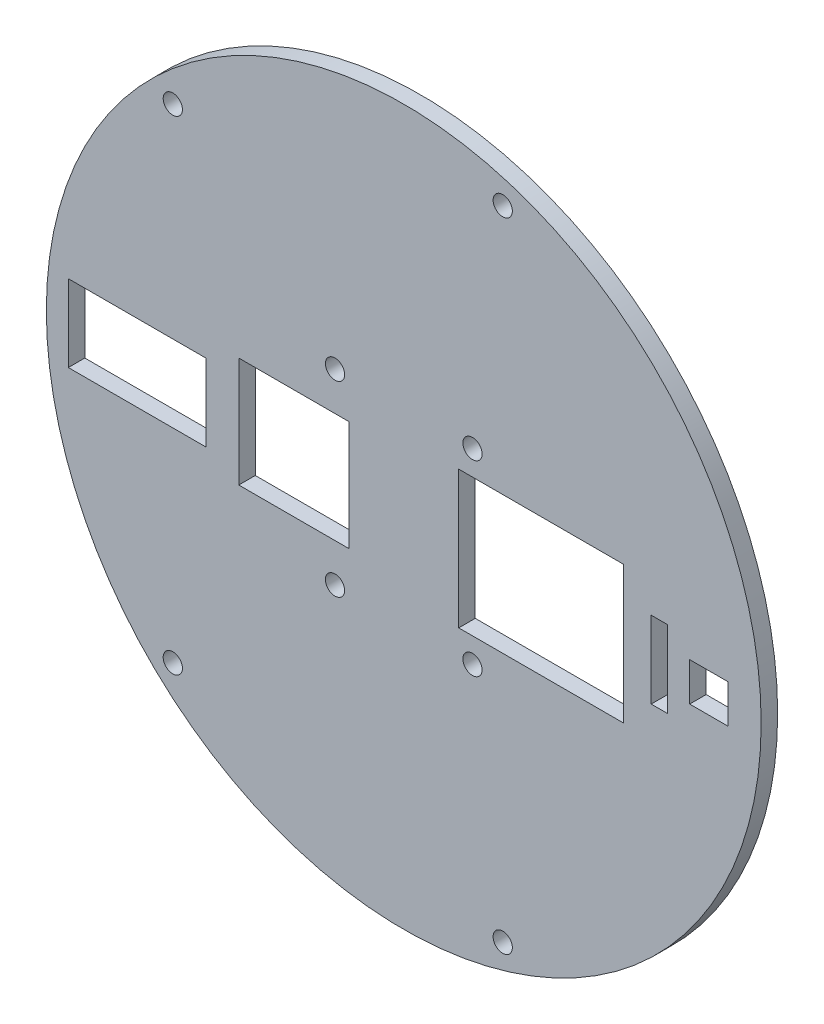
ISO-10303-21;
HEADER;
FILE_DESCRIPTION(('STEP AP214'),'2;1');
FILE_NAME('part.step','',(''),(''),'','','');
FILE_SCHEMA(('AUTOMOTIVE_DESIGN { 1 0 10303 214 1 1 1 1 }'));
ENDSEC;
DATA;
#1=APPLICATION_CONTEXT('core data for automotive mechanical design processes');
#2=APPLICATION_PROTOCOL_DEFINITION('international standard','automotive_design',2000,#1);
#3=PRODUCT_CONTEXT('',#1,'mechanical');
#4=PRODUCT('Part','Part','',(#3));
#5=PRODUCT_RELATED_PRODUCT_CATEGORY('part','',(#4));
#6=PRODUCT_DEFINITION_FORMATION('','',#4);
#7=PRODUCT_DEFINITION_CONTEXT('part definition',#1,'design');
#8=PRODUCT_DEFINITION('design','',#6,#7);
#9=PRODUCT_DEFINITION_SHAPE('','',#8);
#10=(LENGTH_UNIT() NAMED_UNIT(*) SI_UNIT(.MILLI.,.METRE.));
#11=(NAMED_UNIT(*) PLANE_ANGLE_UNIT() SI_UNIT($,.RADIAN.));
#12=(NAMED_UNIT(*) SI_UNIT($,.STERADIAN.) SOLID_ANGLE_UNIT());
#13=UNCERTAINTY_MEASURE_WITH_UNIT(LENGTH_MEASURE(1.E-05),#10,'distance_accuracy_value','');
#14=(GEOMETRIC_REPRESENTATION_CONTEXT(3) GLOBAL_UNCERTAINTY_ASSIGNED_CONTEXT((#13)) GLOBAL_UNIT_ASSIGNED_CONTEXT((#10,
#11,#12)) REPRESENTATION_CONTEXT('',''));
#15=CARTESIAN_POINT('',(0.,0.,0.));
#16=DIRECTION('',(0.,0.,1.));
#17=DIRECTION('',(1.,0.,0.));
#18=AXIS2_PLACEMENT_3D('',#15,#16,#17);
#19=CARTESIAN_POINT('',(0.,0.,3.));
#20=DIRECTION('',(0.,0.,1.));
#21=DIRECTION('',(1.,0.,0.));
#22=AXIS2_PLACEMENT_3D('',#19,#20,#21);
#23=PLANE('',#22);
#24=CARTESIAN_POINT('',(-42.,-44.,3.));
#25=DIRECTION('',(0.,0.,1.));
#26=DIRECTION('',(-1.,0.,0.));
#27=AXIS2_PLACEMENT_3D('',#24,#25,#26);
#28=CIRCLE('',#27,1.75);
#29=CARTESIAN_POINT('',(-43.75,-44.,3.));
#30=VERTEX_POINT('',#29);
#31=EDGE_CURVE('E536',#30,#30,#28,.T.);
#32=ORIENTED_EDGE('',*,*,#31,.F.);
#33=EDGE_LOOP('',(#32));
#34=FACE_BOUND('',#33,.T.);
#35=CARTESIAN_POINT('',(18.,-58.,3.));
#36=DIRECTION('',(0.,0.,1.));
#37=DIRECTION('',(-1.,0.,0.));
#38=AXIS2_PLACEMENT_3D('',#35,#36,#37);
#39=CIRCLE('',#38,1.75);
#40=CARTESIAN_POINT('',(16.25,-58.,3.));
#41=VERTEX_POINT('',#40);
#42=EDGE_CURVE('E538',#41,#41,#39,.T.);
#43=ORIENTED_EDGE('',*,*,#42,.F.);
#44=EDGE_LOOP('',(#43));
#45=FACE_BOUND('',#44,.T.);
#46=CARTESIAN_POINT('',(18.,58.,3.));
#47=DIRECTION('',(0.,0.,1.));
#48=DIRECTION('',(1.,0.,0.));
#49=AXIS2_PLACEMENT_3D('',#46,#47,#48);
#50=CIRCLE('',#49,1.75);
#51=CARTESIAN_POINT('',(19.75,58.,3.));
#52=VERTEX_POINT('',#51);
#53=EDGE_CURVE('E549',#52,#52,#50,.T.);
#54=ORIENTED_EDGE('',*,*,#53,.F.);
#55=EDGE_LOOP('',(#54));
#56=FACE_BOUND('',#55,.T.);
#57=CARTESIAN_POINT('',(-42.,44.,3.));
#58=DIRECTION('',(0.,0.,1.));
#59=DIRECTION('',(1.,0.,0.));
#60=AXIS2_PLACEMENT_3D('',#57,#58,#59);
#61=CIRCLE('',#60,1.75);
#62=CARTESIAN_POINT('',(-40.25,44.,3.));
#63=VERTEX_POINT('',#62);
#64=EDGE_CURVE('E543',#63,#63,#61,.T.);
#65=ORIENTED_EDGE('',*,*,#64,.F.);
#66=EDGE_LOOP('',(#65));
#67=FACE_BOUND('',#66,.T.);
#68=CARTESIAN_POINT('',(12.5,-17.,3.));
#69=DIRECTION('',(0.,0.,1.));
#70=DIRECTION('',(-1.,0.,0.));
#71=AXIS2_PLACEMENT_3D('',#68,#69,#70);
#72=CIRCLE('',#71,1.75);
#73=CARTESIAN_POINT('',(10.75,-17.,3.));
#74=VERTEX_POINT('',#73);
#75=EDGE_CURVE('E219',#74,#74,#72,.T.);
#76=ORIENTED_EDGE('',*,*,#75,.F.);
#77=EDGE_LOOP('',(#76));
#78=FACE_BOUND('',#77,.T.);
#79=CARTESIAN_POINT('',(-12.5,17.,3.));
#80=DIRECTION('',(0.,0.,1.));
#81=DIRECTION('',(1.,0.,0.));
#82=AXIS2_PLACEMENT_3D('',#79,#80,#81);
#83=CIRCLE('',#82,1.75);
#84=CARTESIAN_POINT('',(-10.75,17.,3.));
#85=VERTEX_POINT('',#84);
#86=EDGE_CURVE('E262',#85,#85,#83,.T.);
#87=ORIENTED_EDGE('',*,*,#86,.F.);
#88=EDGE_LOOP('',(#87));
#89=FACE_BOUND('',#88,.T.);
#90=CARTESIAN_POINT('',(0.,0.,3.));
#91=DIRECTION('',(0.,0.,1.));
#92=DIRECTION('',(1.,0.,0.));
#93=AXIS2_PLACEMENT_3D('',#90,#91,#92);
#94=CIRCLE('',#93,65.);
#95=CARTESIAN_POINT('',(65.,0.,3.));
#96=VERTEX_POINT('',#95);
#97=EDGE_CURVE('E11',#96,#96,#94,.T.);
#98=ORIENTED_EDGE('',*,*,#97,.T.);
#99=EDGE_LOOP('',(#98));
#100=FACE_BOUND('',#99,.T.);
#101=DIRECTION('',(1.,0.,0.));
#102=VECTOR('',#101,1.);
#103=CARTESIAN_POINT('',(-30.,-10.,3.));
#104=LINE('',#103,#102);
#105=CARTESIAN_POINT('',(-30.,-10.,3.));
#106=VERTEX_POINT('',#105);
#107=CARTESIAN_POINT('',(-9.99999999999999,-10.,3.));
#108=VERTEX_POINT('',#107);
#109=EDGE_CURVE('E332',#106,#108,#104,.T.);
#110=ORIENTED_EDGE('',*,*,#109,.F.);
#111=DIRECTION('',(0.,-1.,0.));
#112=VECTOR('',#111,1.);
#113=CARTESIAN_POINT('',(-30.,10.,3.));
#114=LINE('',#113,#112);
#115=CARTESIAN_POINT('',(-30.,10.,3.));
#116=VERTEX_POINT('',#115);
#117=EDGE_CURVE('E330',#116,#106,#114,.T.);
#118=ORIENTED_EDGE('',*,*,#117,.F.);
#119=DIRECTION('',(-1.,0.,0.));
#120=VECTOR('',#119,1.);
#121=CARTESIAN_POINT('',(-30.,10.,3.));
#122=LINE('',#121,#120);
#123=CARTESIAN_POINT('',(-9.99999999999999,10.,3.));
#124=VERTEX_POINT('',#123);
#125=EDGE_CURVE('E338',#124,#116,#122,.T.);
#126=ORIENTED_EDGE('',*,*,#125,.F.);
#127=DIRECTION('',(0.,1.,0.));
#128=VECTOR('',#127,1.);
#129=CARTESIAN_POINT('',(-9.99999999999999,10.,3.));
#130=LINE('',#129,#128);
#131=EDGE_CURVE('E335',#108,#124,#130,.T.);
#132=ORIENTED_EDGE('',*,*,#131,.F.);
#133=EDGE_LOOP('',(#110,#118,#126,#132));
#134=FACE_BOUND('',#133,.T.);
#135=DIRECTION('',(1.,0.,0.));
#136=VECTOR('',#135,1.);
#137=CARTESIAN_POINT('',(-61.,-6.99999999999991,3.));
#138=LINE('',#137,#136);
#139=CARTESIAN_POINT('',(-61.,-6.99999999999991,3.));
#140=VERTEX_POINT('',#139);
#141=CARTESIAN_POINT('',(-36.,-6.99999999999991,3.));
#142=VERTEX_POINT('',#141);
#143=EDGE_CURVE('E301',#140,#142,#138,.T.);
#144=ORIENTED_EDGE('',*,*,#143,.F.);
#145=DIRECTION('',(0.,-1.,0.));
#146=VECTOR('',#145,1.);
#147=CARTESIAN_POINT('',(-61.,7.,3.));
#148=LINE('',#147,#146);
#149=CARTESIAN_POINT('',(-61.,7.,3.));
#150=VERTEX_POINT('',#149);
#151=EDGE_CURVE('E299',#150,#140,#148,.T.);
#152=ORIENTED_EDGE('',*,*,#151,.F.);
#153=DIRECTION('',(-1.,0.,0.));
#154=VECTOR('',#153,1.);
#155=CARTESIAN_POINT('',(-61.,7.,3.));
#156=LINE('',#155,#154);
#157=CARTESIAN_POINT('',(-36.,7.,3.));
#158=VERTEX_POINT('',#157);
#159=EDGE_CURVE('E307',#158,#150,#156,.T.);
#160=ORIENTED_EDGE('',*,*,#159,.F.);
#161=DIRECTION('',(0.,1.,0.));
#162=VECTOR('',#161,1.);
#163=CARTESIAN_POINT('',(-36.,7.,3.));
#164=LINE('',#163,#162);
#165=EDGE_CURVE('E304',#142,#158,#164,.T.);
#166=ORIENTED_EDGE('',*,*,#165,.F.);
#167=EDGE_LOOP('',(#144,#152,#160,#166));
#168=FACE_BOUND('',#167,.T.);
#169=DIRECTION('',(1.,0.,0.));
#170=VECTOR('',#169,1.);
#171=CARTESIAN_POINT('',(10.,-12.5,3.));
#172=LINE('',#171,#170);
#173=CARTESIAN_POINT('',(10.,-12.5,3.));
#174=VERTEX_POINT('',#173);
#175=CARTESIAN_POINT('',(40.,-12.5,3.));
#176=VERTEX_POINT('',#175);
#177=EDGE_CURVE('E270',#174,#176,#172,.T.);
#178=ORIENTED_EDGE('',*,*,#177,.F.);
#179=DIRECTION('',(0.,-1.,0.));
#180=VECTOR('',#179,1.);
#181=CARTESIAN_POINT('',(10.,12.5,3.));
#182=LINE('',#181,#180);
#183=CARTESIAN_POINT('',(10.,12.5,3.));
#184=VERTEX_POINT('',#183);
#185=EDGE_CURVE('E268',#184,#174,#182,.T.);
#186=ORIENTED_EDGE('',*,*,#185,.F.);
#187=DIRECTION('',(-1.,0.,0.));
#188=VECTOR('',#187,1.);
#189=CARTESIAN_POINT('',(10.,12.5,3.));
#190=LINE('',#189,#188);
#191=CARTESIAN_POINT('',(40.,12.5,3.));
#192=VERTEX_POINT('',#191);
#193=EDGE_CURVE('E276',#192,#184,#190,.T.);
#194=ORIENTED_EDGE('',*,*,#193,.F.);
#195=DIRECTION('',(0.,1.,0.));
#196=VECTOR('',#195,1.);
#197=CARTESIAN_POINT('',(40.,12.5,3.));
#198=LINE('',#197,#196);
#199=EDGE_CURVE('E273',#176,#192,#198,.T.);
#200=ORIENTED_EDGE('',*,*,#199,.F.);
#201=EDGE_LOOP('',(#178,#186,#194,#200));
#202=FACE_BOUND('',#201,.T.);
#203=CARTESIAN_POINT('',(12.5,17.,3.));
#204=DIRECTION('',(0.,0.,1.));
#205=DIRECTION('',(1.,0.,0.));
#206=AXIS2_PLACEMENT_3D('',#203,#204,#205);
#207=CIRCLE('',#206,1.75);
#208=CARTESIAN_POINT('',(14.25,17.,3.));
#209=VERTEX_POINT('',#208);
#210=EDGE_CURVE('E256',#209,#209,#207,.T.);
#211=ORIENTED_EDGE('',*,*,#210,.F.);
#212=EDGE_LOOP('',(#211));
#213=FACE_BOUND('',#212,.T.);
#214=DIRECTION('',(1.,0.,0.));
#215=VECTOR('',#214,1.);
#216=CARTESIAN_POINT('',(52.,-3.5,3.));
#217=LINE('',#216,#215);
#218=CARTESIAN_POINT('',(52.,-3.5,3.));
#219=VERTEX_POINT('',#218);
#220=CARTESIAN_POINT('',(59.,-3.5,3.));
#221=VERTEX_POINT('',#220);
#222=EDGE_CURVE('E227',#219,#221,#217,.T.);
#223=ORIENTED_EDGE('',*,*,#222,.F.);
#224=DIRECTION('',(0.,-1.,0.));
#225=VECTOR('',#224,1.);
#226=CARTESIAN_POINT('',(52.,3.5,3.));
#227=LINE('',#226,#225);
#228=CARTESIAN_POINT('',(52.,3.5,3.));
#229=VERTEX_POINT('',#228);
#230=EDGE_CURVE('E225',#229,#219,#227,.T.);
#231=ORIENTED_EDGE('',*,*,#230,.F.);
#232=DIRECTION('',(-1.,0.,0.));
#233=VECTOR('',#232,1.);
#234=CARTESIAN_POINT('',(52.,3.5,3.));
#235=LINE('',#234,#233);
#236=CARTESIAN_POINT('',(59.,3.5,3.));
#237=VERTEX_POINT('',#236);
#238=EDGE_CURVE('E233',#237,#229,#235,.T.);
#239=ORIENTED_EDGE('',*,*,#238,.F.);
#240=DIRECTION('',(0.,1.,0.));
#241=VECTOR('',#240,1.);
#242=CARTESIAN_POINT('',(59.,3.5,3.));
#243=LINE('',#242,#241);
#244=EDGE_CURVE('E230',#221,#237,#243,.T.);
#245=ORIENTED_EDGE('',*,*,#244,.F.);
#246=EDGE_LOOP('',(#223,#231,#239,#245));
#247=FACE_BOUND('',#246,.T.);
#248=CARTESIAN_POINT('',(-12.5,-17.,3.));
#249=DIRECTION('',(0.,0.,1.));
#250=DIRECTION('',(-1.,0.,0.));
#251=AXIS2_PLACEMENT_3D('',#248,#249,#250);
#252=CIRCLE('',#251,1.75);
#253=CARTESIAN_POINT('',(-14.25,-17.,3.));
#254=VERTEX_POINT('',#253);
#255=EDGE_CURVE('E213',#254,#254,#252,.T.);
#256=ORIENTED_EDGE('',*,*,#255,.F.);
#257=EDGE_LOOP('',(#256));
#258=FACE_BOUND('',#257,.T.);
#259=DIRECTION('',(1.,0.,0.));
#260=VECTOR('',#259,1.);
#261=CARTESIAN_POINT('',(45.,-6.99999999999991,3.));
#262=LINE('',#261,#260);
#263=CARTESIAN_POINT('',(45.,-6.99999999999991,3.));
#264=VERTEX_POINT('',#263);
#265=CARTESIAN_POINT('',(48.,-6.99999999999991,3.));
#266=VERTEX_POINT('',#265);
#267=EDGE_CURVE('E183',#264,#266,#262,.T.);
#268=ORIENTED_EDGE('',*,*,#267,.F.);
#269=DIRECTION('',(0.,-1.,0.));
#270=VECTOR('',#269,1.);
#271=CARTESIAN_POINT('',(45.,7.,3.));
#272=LINE('',#271,#270);
#273=CARTESIAN_POINT('',(45.,7.,3.));
#274=VERTEX_POINT('',#273);
#275=EDGE_CURVE('E175',#274,#264,#272,.T.);
#276=ORIENTED_EDGE('',*,*,#275,.F.);
#277=DIRECTION('',(-1.,0.,0.));
#278=VECTOR('',#277,1.);
#279=CARTESIAN_POINT('',(45.,7.,3.));
#280=LINE('',#279,#278);
#281=CARTESIAN_POINT('',(48.,7.,3.));
#282=VERTEX_POINT('',#281);
#283=EDGE_CURVE('E197',#282,#274,#280,.T.);
#284=ORIENTED_EDGE('',*,*,#283,.F.);
#285=DIRECTION('',(0.,1.,0.));
#286=VECTOR('',#285,1.);
#287=CARTESIAN_POINT('',(48.,7.,3.));
#288=LINE('',#287,#286);
#289=EDGE_CURVE('E195',#266,#282,#288,.T.);
#290=ORIENTED_EDGE('',*,*,#289,.F.);
#291=EDGE_LOOP('',(#268,#276,#284,#290));
#292=FACE_BOUND('',#291,.T.);
#293=ADVANCED_FACE('F38',(#34,#45,#56,#67,#78,#89,#100,#134,#168,#202,#213,#247,#258,#292),#23,.T.);
#294=CARTESIAN_POINT('',(0.,0.,0.));
#295=DIRECTION('',(0.,0.,1.));
#296=DIRECTION('',(1.,0.,0.));
#297=AXIS2_PLACEMENT_3D('',#294,#295,#296);
#298=PLANE('',#297);
#299=CARTESIAN_POINT('',(-42.,-44.,0.));
#300=DIRECTION('',(0.,0.,1.));
#301=DIRECTION('',(-1.,0.,0.));
#302=AXIS2_PLACEMENT_3D('',#299,#300,#301);
#303=CIRCLE('',#302,1.75);
#304=CARTESIAN_POINT('',(-43.75,-44.,0.));
#305=VERTEX_POINT('',#304);
#306=EDGE_CURVE('E534',#305,#305,#303,.T.);
#307=ORIENTED_EDGE('',*,*,#306,.T.);
#308=EDGE_LOOP('',(#307));
#309=FACE_BOUND('',#308,.T.);
#310=CARTESIAN_POINT('',(18.,-58.,0.));
#311=DIRECTION('',(0.,0.,1.));
#312=DIRECTION('',(-1.,0.,0.));
#313=AXIS2_PLACEMENT_3D('',#310,#311,#312);
#314=CIRCLE('',#313,1.75);
#315=CARTESIAN_POINT('',(16.25,-58.,0.));
#316=VERTEX_POINT('',#315);
#317=EDGE_CURVE('E554',#316,#316,#314,.T.);
#318=ORIENTED_EDGE('',*,*,#317,.T.);
#319=EDGE_LOOP('',(#318));
#320=FACE_BOUND('',#319,.T.);
#321=CARTESIAN_POINT('',(18.,58.,0.));
#322=DIRECTION('',(0.,0.,1.));
#323=DIRECTION('',(1.,0.,0.));
#324=AXIS2_PLACEMENT_3D('',#321,#322,#323);
#325=CIRCLE('',#324,1.75);
#326=CARTESIAN_POINT('',(19.75,58.,0.));
#327=VERTEX_POINT('',#326);
#328=EDGE_CURVE('E545',#327,#327,#325,.T.);
#329=ORIENTED_EDGE('',*,*,#328,.T.);
#330=EDGE_LOOP('',(#329));
#331=FACE_BOUND('',#330,.T.);
#332=CARTESIAN_POINT('',(-42.,44.,0.));
#333=DIRECTION('',(0.,0.,1.));
#334=DIRECTION('',(1.,0.,0.));
#335=AXIS2_PLACEMENT_3D('',#332,#333,#334);
#336=CIRCLE('',#335,1.75);
#337=CARTESIAN_POINT('',(-40.25,44.,0.));
#338=VERTEX_POINT('',#337);
#339=EDGE_CURVE('E203',#338,#338,#336,.T.);
#340=ORIENTED_EDGE('',*,*,#339,.T.);
#341=EDGE_LOOP('',(#340));
#342=FACE_BOUND('',#341,.T.);
#343=CARTESIAN_POINT('',(-12.5,-17.,0.));
#344=DIRECTION('',(0.,0.,1.));
#345=DIRECTION('',(-1.,0.,0.));
#346=AXIS2_PLACEMENT_3D('',#343,#344,#345);
#347=CIRCLE('',#346,1.75);
#348=CARTESIAN_POINT('',(-14.25,-17.,0.));
#349=VERTEX_POINT('',#348);
#350=EDGE_CURVE('E191',#349,#349,#347,.T.);
#351=ORIENTED_EDGE('',*,*,#350,.T.);
#352=EDGE_LOOP('',(#351));
#353=FACE_BOUND('',#352,.T.);
#354=CARTESIAN_POINT('',(12.5,-17.,0.));
#355=DIRECTION('',(0.,0.,1.));
#356=DIRECTION('',(-1.,0.,0.));
#357=AXIS2_PLACEMENT_3D('',#354,#355,#356);
#358=CIRCLE('',#357,1.75);
#359=CARTESIAN_POINT('',(10.75,-17.,0.));
#360=VERTEX_POINT('',#359);
#361=EDGE_CURVE('E216',#360,#360,#358,.T.);
#362=ORIENTED_EDGE('',*,*,#361,.T.);
#363=EDGE_LOOP('',(#362));
#364=FACE_BOUND('',#363,.T.);
#365=DIRECTION('',(0.,-1.,0.));
#366=VECTOR('',#365,1.);
#367=CARTESIAN_POINT('',(52.,3.5,0.));
#368=LINE('',#367,#366);
#369=CARTESIAN_POINT('',(52.,3.5,0.));
#370=VERTEX_POINT('',#369);
#371=CARTESIAN_POINT('',(52.,-3.5,0.));
#372=VERTEX_POINT('',#371);
#373=EDGE_CURVE('E222',#370,#372,#368,.T.);
#374=ORIENTED_EDGE('',*,*,#373,.T.);
#375=DIRECTION('',(1.,0.,0.));
#376=VECTOR('',#375,1.);
#377=CARTESIAN_POINT('',(52.,-3.5,0.));
#378=LINE('',#377,#376);
#379=CARTESIAN_POINT('',(59.,-3.5,0.));
#380=VERTEX_POINT('',#379);
#381=EDGE_CURVE('E238',#372,#380,#378,.T.);
#382=ORIENTED_EDGE('',*,*,#381,.T.);
#383=DIRECTION('',(0.,1.,0.));
#384=VECTOR('',#383,1.);
#385=CARTESIAN_POINT('',(59.,3.5,0.));
#386=LINE('',#385,#384);
#387=CARTESIAN_POINT('',(59.,3.5,0.));
#388=VERTEX_POINT('',#387);
#389=EDGE_CURVE('E241',#380,#388,#386,.T.);
#390=ORIENTED_EDGE('',*,*,#389,.T.);
#391=DIRECTION('',(-1.,0.,0.));
#392=VECTOR('',#391,1.);
#393=CARTESIAN_POINT('',(52.,3.5,0.));
#394=LINE('',#393,#392);
#395=EDGE_CURVE('E228',#388,#370,#394,.T.);
#396=ORIENTED_EDGE('',*,*,#395,.T.);
#397=EDGE_LOOP('',(#374,#382,#390,#396));
#398=FACE_BOUND('',#397,.T.);
#399=DIRECTION('',(0.,-1.,0.));
#400=VECTOR('',#399,1.);
#401=CARTESIAN_POINT('',(-61.,7.,0.));
#402=LINE('',#401,#400);
#403=CARTESIAN_POINT('',(-61.,7.,0.));
#404=VERTEX_POINT('',#403);
#405=CARTESIAN_POINT('',(-61.,-6.99999999999991,0.));
#406=VERTEX_POINT('',#405);
#407=EDGE_CURVE('E298',#404,#406,#402,.T.);
#408=ORIENTED_EDGE('',*,*,#407,.T.);
#409=DIRECTION('',(1.,0.,0.));
#410=VECTOR('',#409,1.);
#411=CARTESIAN_POINT('',(-61.,-6.99999999999991,0.));
#412=LINE('',#411,#410);
#413=CARTESIAN_POINT('',(-36.,-6.99999999999991,0.));
#414=VERTEX_POINT('',#413);
#415=EDGE_CURVE('E312',#406,#414,#412,.T.);
#416=ORIENTED_EDGE('',*,*,#415,.T.);
#417=DIRECTION('',(0.,1.,0.));
#418=VECTOR('',#417,1.);
#419=CARTESIAN_POINT('',(-36.,7.,0.));
#420=LINE('',#419,#418);
#421=CARTESIAN_POINT('',(-36.,7.,0.));
#422=VERTEX_POINT('',#421);
#423=EDGE_CURVE('E315',#414,#422,#420,.T.);
#424=ORIENTED_EDGE('',*,*,#423,.T.);
#425=DIRECTION('',(-1.,0.,0.));
#426=VECTOR('',#425,1.);
#427=CARTESIAN_POINT('',(-61.,7.,0.));
#428=LINE('',#427,#426);
#429=EDGE_CURVE('E302',#422,#404,#428,.T.);
#430=ORIENTED_EDGE('',*,*,#429,.T.);
#431=EDGE_LOOP('',(#408,#416,#424,#430));
#432=FACE_BOUND('',#431,.T.);
#433=CARTESIAN_POINT('',(0.,0.,0.));
#434=DIRECTION('',(0.,0.,1.));
#435=DIRECTION('',(1.,0.,0.));
#436=AXIS2_PLACEMENT_3D('',#433,#434,#435);
#437=CIRCLE('',#436,65.);
#438=CARTESIAN_POINT('',(65.,0.,0.));
#439=VERTEX_POINT('',#438);
#440=EDGE_CURVE('E42',#439,#439,#437,.T.);
#441=ORIENTED_EDGE('',*,*,#440,.F.);
#442=EDGE_LOOP('',(#441));
#443=FACE_BOUND('',#442,.T.);
#444=DIRECTION('',(0.,-1.,0.));
#445=VECTOR('',#444,1.);
#446=CARTESIAN_POINT('',(-30.,10.,0.));
#447=LINE('',#446,#445);
#448=CARTESIAN_POINT('',(-30.,10.,0.));
#449=VERTEX_POINT('',#448);
#450=CARTESIAN_POINT('',(-30.,-10.,0.));
#451=VERTEX_POINT('',#450);
#452=EDGE_CURVE('E329',#449,#451,#447,.T.);
#453=ORIENTED_EDGE('',*,*,#452,.T.);
#454=DIRECTION('',(1.,0.,0.));
#455=VECTOR('',#454,1.);
#456=CARTESIAN_POINT('',(-30.,-10.,0.));
#457=LINE('',#456,#455);
#458=CARTESIAN_POINT('',(-9.99999999999999,-10.,0.));
#459=VERTEX_POINT('',#458);
#460=EDGE_CURVE('E343',#451,#459,#457,.T.);
#461=ORIENTED_EDGE('',*,*,#460,.T.);
#462=DIRECTION('',(0.,1.,0.));
#463=VECTOR('',#462,1.);
#464=CARTESIAN_POINT('',(-9.99999999999999,10.,0.));
#465=LINE('',#464,#463);
#466=CARTESIAN_POINT('',(-9.99999999999999,10.,0.));
#467=VERTEX_POINT('',#466);
#468=EDGE_CURVE('E346',#459,#467,#465,.T.);
#469=ORIENTED_EDGE('',*,*,#468,.T.);
#470=DIRECTION('',(-1.,0.,0.));
#471=VECTOR('',#470,1.);
#472=CARTESIAN_POINT('',(-30.,10.,0.));
#473=LINE('',#472,#471);
#474=EDGE_CURVE('E333',#467,#449,#473,.T.);
#475=ORIENTED_EDGE('',*,*,#474,.T.);
#476=EDGE_LOOP('',(#453,#461,#469,#475));
#477=FACE_BOUND('',#476,.T.);
#478=DIRECTION('',(0.,-1.,0.));
#479=VECTOR('',#478,1.);
#480=CARTESIAN_POINT('',(10.,12.5,0.));
#481=LINE('',#480,#479);
#482=CARTESIAN_POINT('',(10.,12.5,0.));
#483=VERTEX_POINT('',#482);
#484=CARTESIAN_POINT('',(10.,-12.5,0.));
#485=VERTEX_POINT('',#484);
#486=EDGE_CURVE('E265',#483,#485,#481,.T.);
#487=ORIENTED_EDGE('',*,*,#486,.T.);
#488=DIRECTION('',(1.,0.,0.));
#489=VECTOR('',#488,1.);
#490=CARTESIAN_POINT('',(10.,-12.5,0.));
#491=LINE('',#490,#489);
#492=CARTESIAN_POINT('',(40.,-12.5,0.));
#493=VERTEX_POINT('',#492);
#494=EDGE_CURVE('E281',#485,#493,#491,.T.);
#495=ORIENTED_EDGE('',*,*,#494,.T.);
#496=DIRECTION('',(0.,1.,0.));
#497=VECTOR('',#496,1.);
#498=CARTESIAN_POINT('',(40.,12.5,0.));
#499=LINE('',#498,#497);
#500=CARTESIAN_POINT('',(40.,12.5,0.));
#501=VERTEX_POINT('',#500);
#502=EDGE_CURVE('E284',#493,#501,#499,.T.);
#503=ORIENTED_EDGE('',*,*,#502,.T.);
#504=DIRECTION('',(-1.,0.,0.));
#505=VECTOR('',#504,1.);
#506=CARTESIAN_POINT('',(10.,12.5,0.));
#507=LINE('',#506,#505);
#508=EDGE_CURVE('E271',#501,#483,#507,.T.);
#509=ORIENTED_EDGE('',*,*,#508,.T.);
#510=EDGE_LOOP('',(#487,#495,#503,#509));
#511=FACE_BOUND('',#510,.T.);
#512=CARTESIAN_POINT('',(-12.5,17.,0.));
#513=DIRECTION('',(0.,0.,1.));
#514=DIRECTION('',(1.,0.,0.));
#515=AXIS2_PLACEMENT_3D('',#512,#513,#514);
#516=CIRCLE('',#515,1.75);
#517=CARTESIAN_POINT('',(-10.75,17.,0.));
#518=VERTEX_POINT('',#517);
#519=EDGE_CURVE('E259',#518,#518,#516,.T.);
#520=ORIENTED_EDGE('',*,*,#519,.T.);
#521=EDGE_LOOP('',(#520));
#522=FACE_BOUND('',#521,.T.);
#523=CARTESIAN_POINT('',(12.5,17.,0.));
#524=DIRECTION('',(0.,0.,1.));
#525=DIRECTION('',(1.,0.,0.));
#526=AXIS2_PLACEMENT_3D('',#523,#524,#525);
#527=CIRCLE('',#526,1.75);
#528=CARTESIAN_POINT('',(14.25,17.,0.));
#529=VERTEX_POINT('',#528);
#530=EDGE_CURVE('E255',#529,#529,#527,.T.);
#531=ORIENTED_EDGE('',*,*,#530,.T.);
#532=EDGE_LOOP('',(#531));
#533=FACE_BOUND('',#532,.T.);
#534=DIRECTION('',(0.,-1.,0.));
#535=VECTOR('',#534,1.);
#536=CARTESIAN_POINT('',(45.,7.,0.));
#537=LINE('',#536,#535);
#538=CARTESIAN_POINT('',(45.,7.,0.));
#539=VERTEX_POINT('',#538);
#540=CARTESIAN_POINT('',(45.,-6.99999999999991,0.));
#541=VERTEX_POINT('',#540);
#542=EDGE_CURVE('E61',#539,#541,#537,.T.);
#543=ORIENTED_EDGE('',*,*,#542,.T.);
#544=DIRECTION('',(1.,0.,0.));
#545=VECTOR('',#544,1.);
#546=CARTESIAN_POINT('',(45.,-6.99999999999991,0.));
#547=LINE('',#546,#545);
#548=CARTESIAN_POINT('',(48.,-6.99999999999991,0.));
#549=VERTEX_POINT('',#548);
#550=EDGE_CURVE('E190',#541,#549,#547,.T.);
#551=ORIENTED_EDGE('',*,*,#550,.T.);
#552=DIRECTION('',(0.,1.,0.));
#553=VECTOR('',#552,1.);
#554=CARTESIAN_POINT('',(48.,7.,0.));
#555=LINE('',#554,#553);
#556=CARTESIAN_POINT('',(48.,7.,0.));
#557=VERTEX_POINT('',#556);
#558=EDGE_CURVE('E205',#549,#557,#555,.T.);
#559=ORIENTED_EDGE('',*,*,#558,.T.);
#560=DIRECTION('',(-1.,0.,0.));
#561=VECTOR('',#560,1.);
#562=CARTESIAN_POINT('',(45.,7.,0.));
#563=LINE('',#562,#561);
#564=EDGE_CURVE('E184',#557,#539,#563,.T.);
#565=ORIENTED_EDGE('',*,*,#564,.T.);
#566=EDGE_LOOP('',(#543,#551,#559,#565));
#567=FACE_BOUND('',#566,.T.);
#568=ADVANCED_FACE('F365',(#309,#320,#331,#342,#353,#364,#398,#432,#443,#477,#511,#522,#533,
#567),#298,.F.);
#569=CARTESIAN_POINT('',(0.,0.,3.));
#570=DIRECTION('',(0.,0.,-1.));
#571=DIRECTION('',(-1.,0.,0.));
#572=AXIS2_PLACEMENT_3D('',#569,#570,#571);
#573=CYLINDRICAL_SURFACE('',#572,65.);
#574=ORIENTED_EDGE('',*,*,#97,.F.);
#575=EDGE_LOOP('',(#574));
#576=FACE_BOUND('',#575,.T.);
#577=ORIENTED_EDGE('',*,*,#440,.T.);
#578=EDGE_LOOP('',(#577));
#579=FACE_BOUND('',#578,.T.);
#580=ADVANCED_FACE('F40',(#576,#579),#573,.T.);
#581=CARTESIAN_POINT('',(-30.,10.,3.));
#582=DIRECTION('',(1.,0.,0.));
#583=DIRECTION('',(0.,1.,0.));
#584=AXIS2_PLACEMENT_3D('',#581,#582,#583);
#585=PLANE('',#584);
#586=ORIENTED_EDGE('',*,*,#452,.F.);
#587=DIRECTION('',(0.,0.,-1.));
#588=VECTOR('',#587,1.);
#589=CARTESIAN_POINT('',(-30.,10.,3.));
#590=LINE('',#589,#588);
#591=EDGE_CURVE('E340',#116,#449,#590,.T.);
#592=ORIENTED_EDGE('',*,*,#591,.F.);
#593=ORIENTED_EDGE('',*,*,#117,.T.);
#594=DIRECTION('',(0.,0.,-1.));
#595=VECTOR('',#594,1.);
#596=CARTESIAN_POINT('',(-30.,-10.,3.));
#597=LINE('',#596,#595);
#598=EDGE_CURVE('E357',#106,#451,#597,.T.);
#599=ORIENTED_EDGE('',*,*,#598,.T.);
#600=EDGE_LOOP('',(#586,#592,#593,#599));
#601=FACE_BOUND('',#600,.T.);
#602=ADVANCED_FACE('F398',(#601),#585,.T.);
#603=CARTESIAN_POINT('',(-30.,-10.,3.));
#604=DIRECTION('',(0.,1.,0.));
#605=DIRECTION('',(0.,0.,1.));
#606=AXIS2_PLACEMENT_3D('',#603,#604,#605);
#607=PLANE('',#606);
#608=ORIENTED_EDGE('',*,*,#460,.F.);
#609=ORIENTED_EDGE('',*,*,#598,.F.);
#610=ORIENTED_EDGE('',*,*,#109,.T.);
#611=DIRECTION('',(0.,0.,-1.));
#612=VECTOR('',#611,1.);
#613=CARTESIAN_POINT('',(-9.99999999999999,-10.,3.));
#614=LINE('',#613,#612);
#615=EDGE_CURVE('E355',#108,#459,#614,.T.);
#616=ORIENTED_EDGE('',*,*,#615,.T.);
#617=EDGE_LOOP('',(#608,#609,#610,#616));
#618=FACE_BOUND('',#617,.T.);
#619=ADVANCED_FACE('F401',(#618),#607,.T.);
#620=CARTESIAN_POINT('',(-9.99999999999999,10.,3.));
#621=DIRECTION('',(-1.,0.,0.));
#622=DIRECTION('',(0.,-1.,0.));
#623=AXIS2_PLACEMENT_3D('',#620,#621,#622);
#624=PLANE('',#623);
#625=ORIENTED_EDGE('',*,*,#468,.F.);
#626=ORIENTED_EDGE('',*,*,#615,.F.);
#627=ORIENTED_EDGE('',*,*,#131,.T.);
#628=DIRECTION('',(0.,0.,-1.));
#629=VECTOR('',#628,1.);
#630=CARTESIAN_POINT('',(-9.99999999999999,10.,3.));
#631=LINE('',#630,#629);
#632=EDGE_CURVE('E353',#124,#467,#631,.T.);
#633=ORIENTED_EDGE('',*,*,#632,.T.);
#634=EDGE_LOOP('',(#625,#626,#627,#633));
#635=FACE_BOUND('',#634,.T.);
#636=ADVANCED_FACE('F404',(#635),#624,.T.);
#637=CARTESIAN_POINT('',(-30.,10.,3.));
#638=DIRECTION('',(0.,-1.,0.));
#639=DIRECTION('',(0.,0.,-1.));
#640=AXIS2_PLACEMENT_3D('',#637,#638,#639);
#641=PLANE('',#640);
#642=ORIENTED_EDGE('',*,*,#474,.F.);
#643=ORIENTED_EDGE('',*,*,#632,.F.);
#644=ORIENTED_EDGE('',*,*,#125,.T.);
#645=ORIENTED_EDGE('',*,*,#591,.T.);
#646=EDGE_LOOP('',(#642,#643,#644,#645));
#647=FACE_BOUND('',#646,.T.);
#648=ADVANCED_FACE('F408',(#647),#641,.T.);
#649=CARTESIAN_POINT('',(-61.,7.,3.));
#650=DIRECTION('',(1.,0.,0.));
#651=DIRECTION('',(0.,0.,-1.));
#652=AXIS2_PLACEMENT_3D('',#649,#650,#651);
#653=PLANE('',#652);
#654=ORIENTED_EDGE('',*,*,#407,.F.);
#655=DIRECTION('',(0.,0.,-1.));
#656=VECTOR('',#655,1.);
#657=CARTESIAN_POINT('',(-61.,7.,3.));
#658=LINE('',#657,#656);
#659=EDGE_CURVE('E309',#150,#404,#658,.T.);
#660=ORIENTED_EDGE('',*,*,#659,.F.);
#661=ORIENTED_EDGE('',*,*,#151,.T.);
#662=DIRECTION('',(0.,0.,-1.));
#663=VECTOR('',#662,1.);
#664=CARTESIAN_POINT('',(-61.,-6.99999999999991,3.));
#665=LINE('',#664,#663);
#666=EDGE_CURVE('E326',#140,#406,#665,.T.);
#667=ORIENTED_EDGE('',*,*,#666,.T.);
#668=EDGE_LOOP('',(#654,#660,#661,#667));
#669=FACE_BOUND('',#668,.T.);
#670=ADVANCED_FACE('F412',(#669),#653,.T.);
#671=CARTESIAN_POINT('',(-61.,-6.99999999999991,3.));
#672=DIRECTION('',(0.,1.,0.));
#673=DIRECTION('',(-1.,0.,0.));
#674=AXIS2_PLACEMENT_3D('',#671,#672,#673);
#675=PLANE('',#674);
#676=ORIENTED_EDGE('',*,*,#415,.F.);
#677=ORIENTED_EDGE('',*,*,#666,.F.);
#678=ORIENTED_EDGE('',*,*,#143,.T.);
#679=DIRECTION('',(0.,0.,-1.));
#680=VECTOR('',#679,1.);
#681=CARTESIAN_POINT('',(-36.,-6.99999999999991,3.));
#682=LINE('',#681,#680);
#683=EDGE_CURVE('E324',#142,#414,#682,.T.);
#684=ORIENTED_EDGE('',*,*,#683,.T.);
#685=EDGE_LOOP('',(#676,#677,#678,#684));
#686=FACE_BOUND('',#685,.T.);
#687=ADVANCED_FACE('F416',(#686),#675,.T.);
#688=CARTESIAN_POINT('',(-36.,7.,3.));
#689=DIRECTION('',(-1.,0.,0.));
#690=DIRECTION('',(0.,0.,1.));
#691=AXIS2_PLACEMENT_3D('',#688,#689,#690);
#692=PLANE('',#691);
#693=ORIENTED_EDGE('',*,*,#423,.F.);
#694=ORIENTED_EDGE('',*,*,#683,.F.);
#695=ORIENTED_EDGE('',*,*,#165,.T.);
#696=DIRECTION('',(0.,0.,-1.));
#697=VECTOR('',#696,1.);
#698=CARTESIAN_POINT('',(-36.,7.,3.));
#699=LINE('',#698,#697);
#700=EDGE_CURVE('E322',#158,#422,#699,.T.);
#701=ORIENTED_EDGE('',*,*,#700,.T.);
#702=EDGE_LOOP('',(#693,#694,#695,#701));
#703=FACE_BOUND('',#702,.T.);
#704=ADVANCED_FACE('F420',(#703),#692,.T.);
#705=CARTESIAN_POINT('',(-61.,7.,3.));
#706=DIRECTION('',(0.,-1.,0.));
#707=DIRECTION('',(0.,0.,-1.));
#708=AXIS2_PLACEMENT_3D('',#705,#706,#707);
#709=PLANE('',#708);
#710=ORIENTED_EDGE('',*,*,#429,.F.);
#711=ORIENTED_EDGE('',*,*,#700,.F.);
#712=ORIENTED_EDGE('',*,*,#159,.T.);
#713=ORIENTED_EDGE('',*,*,#659,.T.);
#714=EDGE_LOOP('',(#710,#711,#712,#713));
#715=FACE_BOUND('',#714,.T.);
#716=ADVANCED_FACE('F424',(#715),#709,.T.);
#717=CARTESIAN_POINT('',(10.,12.5,3.));
#718=DIRECTION('',(1.,0.,0.));
#719=DIRECTION('',(0.,1.,0.));
#720=AXIS2_PLACEMENT_3D('',#717,#718,#719);
#721=PLANE('',#720);
#722=ORIENTED_EDGE('',*,*,#486,.F.);
#723=DIRECTION('',(0.,0.,-1.));
#724=VECTOR('',#723,1.);
#725=CARTESIAN_POINT('',(10.,12.5,3.));
#726=LINE('',#725,#724);
#727=EDGE_CURVE('E278',#184,#483,#726,.T.);
#728=ORIENTED_EDGE('',*,*,#727,.F.);
#729=ORIENTED_EDGE('',*,*,#185,.T.);
#730=DIRECTION('',(0.,0.,-1.));
#731=VECTOR('',#730,1.);
#732=CARTESIAN_POINT('',(10.,-12.5,3.));
#733=LINE('',#732,#731);
#734=EDGE_CURVE('E295',#174,#485,#733,.T.);
#735=ORIENTED_EDGE('',*,*,#734,.T.);
#736=EDGE_LOOP('',(#722,#728,#729,#735));
#737=FACE_BOUND('',#736,.T.);
#738=ADVANCED_FACE('F428',(#737),#721,.T.);
#739=CARTESIAN_POINT('',(10.,-12.5,3.));
#740=DIRECTION('',(0.,1.,0.));
#741=DIRECTION('',(-1.,0.,0.));
#742=AXIS2_PLACEMENT_3D('',#739,#740,#741);
#743=PLANE('',#742);
#744=ORIENTED_EDGE('',*,*,#494,.F.);
#745=ORIENTED_EDGE('',*,*,#734,.F.);
#746=ORIENTED_EDGE('',*,*,#177,.T.);
#747=DIRECTION('',(0.,0.,-1.));
#748=VECTOR('',#747,1.);
#749=CARTESIAN_POINT('',(40.,-12.5,3.));
#750=LINE('',#749,#748);
#751=EDGE_CURVE('E293',#176,#493,#750,.T.);
#752=ORIENTED_EDGE('',*,*,#751,.T.);
#753=EDGE_LOOP('',(#744,#745,#746,#752));
#754=FACE_BOUND('',#753,.T.);
#755=ADVANCED_FACE('F432',(#754),#743,.T.);
#756=CARTESIAN_POINT('',(40.,12.5,3.));
#757=DIRECTION('',(-1.,0.,0.));
#758=DIRECTION('',(0.,0.,1.));
#759=AXIS2_PLACEMENT_3D('',#756,#757,#758);
#760=PLANE('',#759);
#761=ORIENTED_EDGE('',*,*,#502,.F.);
#762=ORIENTED_EDGE('',*,*,#751,.F.);
#763=ORIENTED_EDGE('',*,*,#199,.T.);
#764=DIRECTION('',(0.,0.,-1.));
#765=VECTOR('',#764,1.);
#766=CARTESIAN_POINT('',(40.,12.5,3.));
#767=LINE('',#766,#765);
#768=EDGE_CURVE('E291',#192,#501,#767,.T.);
#769=ORIENTED_EDGE('',*,*,#768,.T.);
#770=EDGE_LOOP('',(#761,#762,#763,#769));
#771=FACE_BOUND('',#770,.T.);
#772=ADVANCED_FACE('F436',(#771),#760,.T.);
#773=CARTESIAN_POINT('',(10.,12.5,3.));
#774=DIRECTION('',(0.,-1.,0.));
#775=DIRECTION('',(0.,0.,-1.));
#776=AXIS2_PLACEMENT_3D('',#773,#774,#775);
#777=PLANE('',#776);
#778=ORIENTED_EDGE('',*,*,#508,.F.);
#779=ORIENTED_EDGE('',*,*,#768,.F.);
#780=ORIENTED_EDGE('',*,*,#193,.T.);
#781=ORIENTED_EDGE('',*,*,#727,.T.);
#782=EDGE_LOOP('',(#778,#779,#780,#781));
#783=FACE_BOUND('',#782,.T.);
#784=ADVANCED_FACE('F440',(#783),#777,.T.);
#785=CARTESIAN_POINT('',(-12.5,17.,3.));
#786=DIRECTION('',(0.,0.,-1.));
#787=DIRECTION('',(-1.,0.,0.));
#788=AXIS2_PLACEMENT_3D('',#785,#786,#787);
#789=CYLINDRICAL_SURFACE('',#788,1.75);
#790=ORIENTED_EDGE('',*,*,#86,.T.);
#791=EDGE_LOOP('',(#790));
#792=FACE_BOUND('',#791,.T.);
#793=ORIENTED_EDGE('',*,*,#519,.F.);
#794=EDGE_LOOP('',(#793));
#795=FACE_BOUND('',#794,.T.);
#796=ADVANCED_FACE('F444',(#792,#795),#789,.F.);
#797=CARTESIAN_POINT('',(12.5,17.,3.));
#798=DIRECTION('',(0.,0.,-1.));
#799=DIRECTION('',(-1.,0.,0.));
#800=AXIS2_PLACEMENT_3D('',#797,#798,#799);
#801=CYLINDRICAL_SURFACE('',#800,1.75);
#802=ORIENTED_EDGE('',*,*,#210,.T.);
#803=EDGE_LOOP('',(#802));
#804=FACE_BOUND('',#803,.T.);
#805=ORIENTED_EDGE('',*,*,#530,.F.);
#806=EDGE_LOOP('',(#805));
#807=FACE_BOUND('',#806,.T.);
#808=ADVANCED_FACE('F448',(#804,#807),#801,.F.);
#809=CARTESIAN_POINT('',(52.,3.5,3.));
#810=DIRECTION('',(1.,0.,0.));
#811=DIRECTION('',(0.,0.,-1.));
#812=AXIS2_PLACEMENT_3D('',#809,#810,#811);
#813=PLANE('',#812);
#814=ORIENTED_EDGE('',*,*,#373,.F.);
#815=DIRECTION('',(0.,0.,-1.));
#816=VECTOR('',#815,1.);
#817=CARTESIAN_POINT('',(52.,3.5,3.));
#818=LINE('',#817,#816);
#819=EDGE_CURVE('E235',#229,#370,#818,.T.);
#820=ORIENTED_EDGE('',*,*,#819,.F.);
#821=ORIENTED_EDGE('',*,*,#230,.T.);
#822=DIRECTION('',(0.,0.,-1.));
#823=VECTOR('',#822,1.);
#824=CARTESIAN_POINT('',(52.,-3.5,3.));
#825=LINE('',#824,#823);
#826=EDGE_CURVE('E252',#219,#372,#825,.T.);
#827=ORIENTED_EDGE('',*,*,#826,.T.);
#828=EDGE_LOOP('',(#814,#820,#821,#827));
#829=FACE_BOUND('',#828,.T.);
#830=ADVANCED_FACE('F452',(#829),#813,.T.);
#831=CARTESIAN_POINT('',(52.,-3.5,3.));
#832=DIRECTION('',(0.,1.,0.));
#833=DIRECTION('',(0.,0.,1.));
#834=AXIS2_PLACEMENT_3D('',#831,#832,#833);
#835=PLANE('',#834);
#836=ORIENTED_EDGE('',*,*,#381,.F.);
#837=ORIENTED_EDGE('',*,*,#826,.F.);
#838=ORIENTED_EDGE('',*,*,#222,.T.);
#839=DIRECTION('',(0.,0.,-1.));
#840=VECTOR('',#839,1.);
#841=CARTESIAN_POINT('',(59.,-3.5,3.));
#842=LINE('',#841,#840);
#843=EDGE_CURVE('E250',#221,#380,#842,.T.);
#844=ORIENTED_EDGE('',*,*,#843,.T.);
#845=EDGE_LOOP('',(#836,#837,#838,#844));
#846=FACE_BOUND('',#845,.T.);
#847=ADVANCED_FACE('F456',(#846),#835,.T.);
#848=CARTESIAN_POINT('',(59.,3.5,3.));
#849=DIRECTION('',(-1.,0.,0.));
#850=DIRECTION('',(0.,0.,1.));
#851=AXIS2_PLACEMENT_3D('',#848,#849,#850);
#852=PLANE('',#851);
#853=ORIENTED_EDGE('',*,*,#389,.F.);
#854=ORIENTED_EDGE('',*,*,#843,.F.);
#855=ORIENTED_EDGE('',*,*,#244,.T.);
#856=DIRECTION('',(0.,0.,-1.));
#857=VECTOR('',#856,1.);
#858=CARTESIAN_POINT('',(59.,3.5,3.));
#859=LINE('',#858,#857);
#860=EDGE_CURVE('E248',#237,#388,#859,.T.);
#861=ORIENTED_EDGE('',*,*,#860,.T.);
#862=EDGE_LOOP('',(#853,#854,#855,#861));
#863=FACE_BOUND('',#862,.T.);
#864=ADVANCED_FACE('F460',(#863),#852,.T.);
#865=CARTESIAN_POINT('',(52.,3.5,3.));
#866=DIRECTION('',(0.,-1.,0.));
#867=DIRECTION('',(0.,0.,-1.));
#868=AXIS2_PLACEMENT_3D('',#865,#866,#867);
#869=PLANE('',#868);
#870=ORIENTED_EDGE('',*,*,#395,.F.);
#871=ORIENTED_EDGE('',*,*,#860,.F.);
#872=ORIENTED_EDGE('',*,*,#238,.T.);
#873=ORIENTED_EDGE('',*,*,#819,.T.);
#874=EDGE_LOOP('',(#870,#871,#872,#873));
#875=FACE_BOUND('',#874,.T.);
#876=ADVANCED_FACE('F464',(#875),#869,.T.);
#877=CARTESIAN_POINT('',(12.5,-17.,3.));
#878=DIRECTION('',(0.,0.,-1.));
#879=DIRECTION('',(-1.,0.,0.));
#880=AXIS2_PLACEMENT_3D('',#877,#878,#879);
#881=CYLINDRICAL_SURFACE('',#880,1.75);
#882=ORIENTED_EDGE('',*,*,#75,.T.);
#883=EDGE_LOOP('',(#882));
#884=FACE_BOUND('',#883,.T.);
#885=ORIENTED_EDGE('',*,*,#361,.F.);
#886=EDGE_LOOP('',(#885));
#887=FACE_BOUND('',#886,.T.);
#888=ADVANCED_FACE('F468',(#884,#887),#881,.F.);
#889=CARTESIAN_POINT('',(-12.5,-17.,3.));
#890=DIRECTION('',(0.,0.,-1.));
#891=DIRECTION('',(-1.,0.,0.));
#892=AXIS2_PLACEMENT_3D('',#889,#890,#891);
#893=CYLINDRICAL_SURFACE('',#892,1.75);
#894=ORIENTED_EDGE('',*,*,#255,.T.);
#895=EDGE_LOOP('',(#894));
#896=FACE_BOUND('',#895,.T.);
#897=ORIENTED_EDGE('',*,*,#350,.F.);
#898=EDGE_LOOP('',(#897));
#899=FACE_BOUND('',#898,.T.);
#900=ADVANCED_FACE('F472',(#896,#899),#893,.F.);
#901=CARTESIAN_POINT('',(45.,7.,3.));
#902=DIRECTION('',(1.,0.,0.));
#903=DIRECTION('',(0.,0.,-1.));
#904=AXIS2_PLACEMENT_3D('',#901,#902,#903);
#905=PLANE('',#904);
#906=ORIENTED_EDGE('',*,*,#542,.F.);
#907=DIRECTION('',(0.,0.,-1.));
#908=VECTOR('',#907,1.);
#909=CARTESIAN_POINT('',(45.,7.,3.));
#910=LINE('',#909,#908);
#911=EDGE_CURVE('E179',#274,#539,#910,.T.);
#912=ORIENTED_EDGE('',*,*,#911,.F.);
#913=ORIENTED_EDGE('',*,*,#275,.T.);
#914=DIRECTION('',(0.,0.,-1.));
#915=VECTOR('',#914,1.);
#916=CARTESIAN_POINT('',(45.,-6.99999999999991,3.));
#917=LINE('',#916,#915);
#918=EDGE_CURVE('E178',#264,#541,#917,.T.);
#919=ORIENTED_EDGE('',*,*,#918,.T.);
#920=EDGE_LOOP('',(#906,#912,#913,#919));
#921=FACE_BOUND('',#920,.T.);
#922=ADVANCED_FACE('F177',(#921),#905,.T.);
#923=CARTESIAN_POINT('',(45.,-6.99999999999991,3.));
#924=DIRECTION('',(0.,1.,0.));
#925=DIRECTION('',(-1.,0.,0.));
#926=AXIS2_PLACEMENT_3D('',#923,#924,#925);
#927=PLANE('',#926);
#928=ORIENTED_EDGE('',*,*,#550,.F.);
#929=ORIENTED_EDGE('',*,*,#918,.F.);
#930=ORIENTED_EDGE('',*,*,#267,.T.);
#931=DIRECTION('',(0.,0.,-1.));
#932=VECTOR('',#931,1.);
#933=CARTESIAN_POINT('',(48.,-6.99999999999991,3.));
#934=LINE('',#933,#932);
#935=EDGE_CURVE('E192',#266,#549,#934,.T.);
#936=ORIENTED_EDGE('',*,*,#935,.T.);
#937=EDGE_LOOP('',(#928,#929,#930,#936));
#938=FACE_BOUND('',#937,.T.);
#939=ADVANCED_FACE('F187',(#938),#927,.T.);
#940=CARTESIAN_POINT('',(48.,7.,3.));
#941=DIRECTION('',(-1.,0.,0.));
#942=DIRECTION('',(0.,0.,1.));
#943=AXIS2_PLACEMENT_3D('',#940,#941,#942);
#944=PLANE('',#943);
#945=ORIENTED_EDGE('',*,*,#558,.F.);
#946=ORIENTED_EDGE('',*,*,#935,.F.);
#947=ORIENTED_EDGE('',*,*,#289,.T.);
#948=DIRECTION('',(0.,0.,-1.));
#949=VECTOR('',#948,1.);
#950=CARTESIAN_POINT('',(48.,7.,3.));
#951=LINE('',#950,#949);
#952=EDGE_CURVE('E53',#282,#557,#951,.T.);
#953=ORIENTED_EDGE('',*,*,#952,.T.);
#954=EDGE_LOOP('',(#945,#946,#947,#953));
#955=FACE_BOUND('',#954,.T.);
#956=ADVANCED_FACE('F379',(#955),#944,.T.);
#957=CARTESIAN_POINT('',(45.,7.,3.));
#958=DIRECTION('',(0.,-1.,0.));
#959=DIRECTION('',(0.,0.,-1.));
#960=AXIS2_PLACEMENT_3D('',#957,#958,#959);
#961=PLANE('',#960);
#962=ORIENTED_EDGE('',*,*,#564,.F.);
#963=ORIENTED_EDGE('',*,*,#952,.F.);
#964=ORIENTED_EDGE('',*,*,#283,.T.);
#965=ORIENTED_EDGE('',*,*,#911,.T.);
#966=EDGE_LOOP('',(#962,#963,#964,#965));
#967=FACE_BOUND('',#966,.T.);
#968=ADVANCED_FACE('F376',(#967),#961,.T.);
#969=CARTESIAN_POINT('',(-42.,44.,0.));
#970=DIRECTION('',(0.,0.,1.));
#971=DIRECTION('',(1.,0.,0.));
#972=AXIS2_PLACEMENT_3D('',#969,#970,#971);
#973=CYLINDRICAL_SURFACE('',#972,1.75);
#974=ORIENTED_EDGE('',*,*,#339,.F.);
#975=EDGE_LOOP('',(#974));
#976=FACE_BOUND('',#975,.T.);
#977=ORIENTED_EDGE('',*,*,#64,.T.);
#978=EDGE_LOOP('',(#977));
#979=FACE_BOUND('',#978,.T.);
#980=ADVANCED_FACE('F378',(#976,#979),#973,.F.);
#981=CARTESIAN_POINT('',(18.,58.,0.));
#982=DIRECTION('',(0.,0.,1.));
#983=DIRECTION('',(1.,0.,0.));
#984=AXIS2_PLACEMENT_3D('',#981,#982,#983);
#985=CYLINDRICAL_SURFACE('',#984,1.75);
#986=ORIENTED_EDGE('',*,*,#328,.F.);
#987=EDGE_LOOP('',(#986));
#988=FACE_BOUND('',#987,.T.);
#989=ORIENTED_EDGE('',*,*,#53,.T.);
#990=EDGE_LOOP('',(#989));
#991=FACE_BOUND('',#990,.T.);
#992=ADVANCED_FACE('F385',(#988,#991),#985,.F.);
#993=CARTESIAN_POINT('',(18.,-58.,0.));
#994=DIRECTION('',(0.,0.,1.));
#995=DIRECTION('',(1.,0.,0.));
#996=AXIS2_PLACEMENT_3D('',#993,#994,#995);
#997=CYLINDRICAL_SURFACE('',#996,1.75);
#998=ORIENTED_EDGE('',*,*,#317,.F.);
#999=EDGE_LOOP('',(#998));
#1000=FACE_BOUND('',#999,.T.);
#1001=ORIENTED_EDGE('',*,*,#42,.T.);
#1002=EDGE_LOOP('',(#1001));
#1003=FACE_BOUND('',#1002,.T.);
#1004=ADVANCED_FACE('F507',(#1000,#1003),#997,.F.);
#1005=CARTESIAN_POINT('',(-42.,-44.,0.));
#1006=DIRECTION('',(0.,0.,1.));
#1007=DIRECTION('',(1.,0.,0.));
#1008=AXIS2_PLACEMENT_3D('',#1005,#1006,#1007);
#1009=CYLINDRICAL_SURFACE('',#1008,1.75);
#1010=ORIENTED_EDGE('',*,*,#306,.F.);
#1011=EDGE_LOOP('',(#1010));
#1012=FACE_BOUND('',#1011,.T.);
#1013=ORIENTED_EDGE('',*,*,#31,.T.);
#1014=EDGE_LOOP('',(#1013));
#1015=FACE_BOUND('',#1014,.T.);
#1016=ADVANCED_FACE('F516',(#1012,#1015),#1009,.F.);
#1017=CLOSED_SHELL('',(#293,#568,#580,#602,#619,#636,#648,#670,#687,#704,#716,#738,#755,#772,
#784,#796,#808,#830,#847,#864,#876,#888,#900,#922,#939,#956,#968,#980,#992,#1004,#1016));
#1018=MANIFOLD_SOLID_BREP('B2',#1017);
#1019=ADVANCED_BREP_SHAPE_REPRESENTATION('',(#18,#1018),#14);
#1020=SHAPE_DEFINITION_REPRESENTATION(#9,#1019);
ENDSEC;
END-ISO-10303-21;
